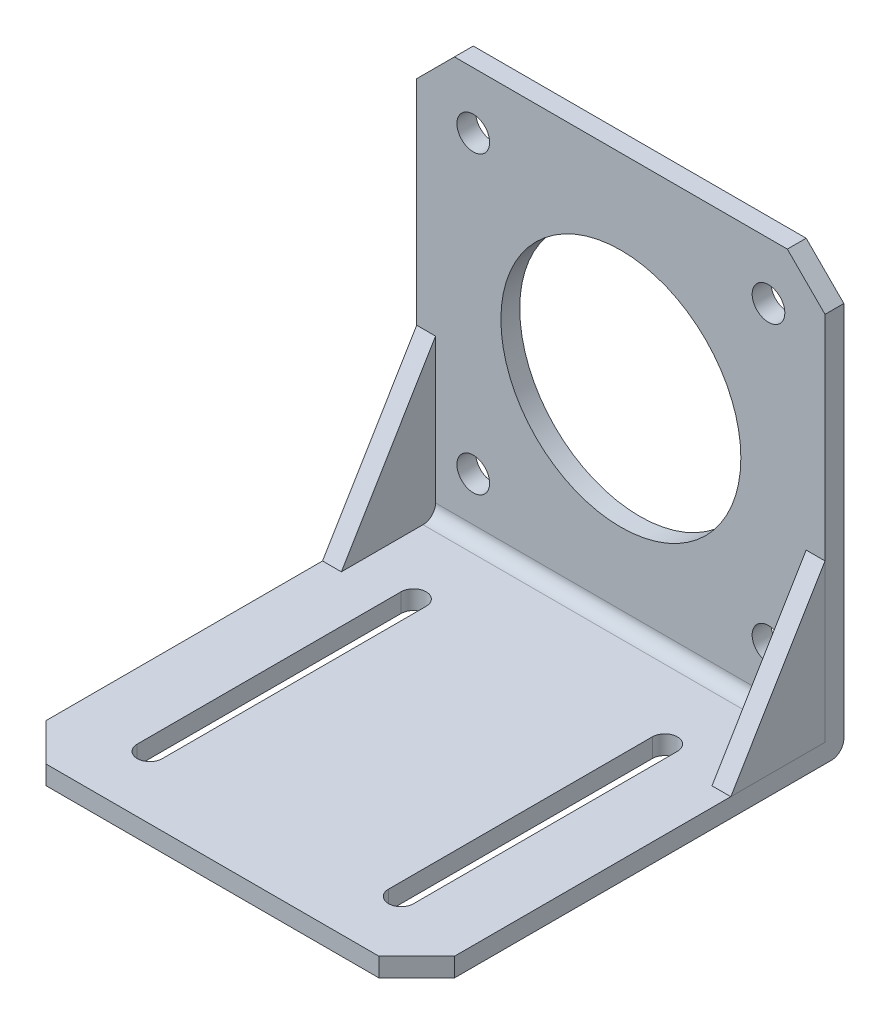
ISO-10303-21;
HEADER;
FILE_DESCRIPTION(('STEP AP214'),'2;1');
FILE_NAME('part.step','',(''),(''),'','','');
FILE_SCHEMA(('AUTOMOTIVE_DESIGN { 1 0 10303 214 1 1 1 1 }'));
ENDSEC;
DATA;
#1=APPLICATION_CONTEXT('core data for automotive mechanical design processes');
#2=APPLICATION_PROTOCOL_DEFINITION('international standard','automotive_design',2000,#1);
#3=PRODUCT_CONTEXT('',#1,'mechanical');
#4=PRODUCT('Part','Part','',(#3));
#5=PRODUCT_RELATED_PRODUCT_CATEGORY('part','',(#4));
#6=PRODUCT_DEFINITION_FORMATION('','',#4);
#7=PRODUCT_DEFINITION_CONTEXT('part definition',#1,'design');
#8=PRODUCT_DEFINITION('design','',#6,#7);
#9=PRODUCT_DEFINITION_SHAPE('','',#8);
#10=(LENGTH_UNIT() NAMED_UNIT(*) SI_UNIT(.MILLI.,.METRE.));
#11=(NAMED_UNIT(*) PLANE_ANGLE_UNIT() SI_UNIT($,.RADIAN.));
#12=(NAMED_UNIT(*) SI_UNIT($,.STERADIAN.) SOLID_ANGLE_UNIT());
#13=UNCERTAINTY_MEASURE_WITH_UNIT(LENGTH_MEASURE(1.E-05),#10,'distance_accuracy_value','');
#14=(GEOMETRIC_REPRESENTATION_CONTEXT(3) GLOBAL_UNCERTAINTY_ASSIGNED_CONTEXT((#13)) GLOBAL_UNIT_ASSIGNED_CONTEXT((#10,
#11,#12)) REPRESENTATION_CONTEXT('',''));
#15=CARTESIAN_POINT('',(0.,0.,0.));
#16=DIRECTION('',(0.,0.,1.));
#17=DIRECTION('',(1.,0.,0.));
#18=AXIS2_PLACEMENT_3D('',#15,#16,#17);
#19=CARTESIAN_POINT('',(-29.5,-32.5,3.));
#20=DIRECTION('',(0.,0.,-1.));
#21=DIRECTION('',(-1.,0.,0.));
#22=AXIS2_PLACEMENT_3D('',#19,#20,#21);
#23=PLANE('',#22);
#24=DIRECTION('',(0.,-1.,0.));
#25=VECTOR('',#24,1.);
#26=CARTESIAN_POINT('',(-32.5,-32.5,3.));
#27=LINE('',#26,#25);
#28=CARTESIAN_POINT('',(-32.5,-7.50000000000001,3.));
#29=VERTEX_POINT('',#28);
#30=CARTESIAN_POINT('',(-32.5,-32.5,3.));
#31=VERTEX_POINT('',#30);
#32=EDGE_CURVE('E95',#29,#31,#27,.T.);
#33=ORIENTED_EDGE('',*,*,#32,.F.);
#34=DIRECTION('',(-1.,0.,0.));
#35=VECTOR('',#34,1.);
#36=CARTESIAN_POINT('',(-29.5,-7.50000000000001,3.));
#37=LINE('',#36,#35);
#38=CARTESIAN_POINT('',(-29.5,-7.50000000000001,3.));
#39=VERTEX_POINT('',#38);
#40=EDGE_CURVE('E12',#39,#29,#37,.T.);
#41=ORIENTED_EDGE('',*,*,#40,.F.);
#42=DIRECTION('',(0.,-1.,0.));
#43=VECTOR('',#42,1.);
#44=CARTESIAN_POINT('',(-29.5,-32.5,3.));
#45=LINE('',#44,#43);
#46=CARTESIAN_POINT('',(-29.5,-32.5,3.));
#47=VERTEX_POINT('',#46);
#48=EDGE_CURVE('E87',#39,#47,#45,.T.);
#49=ORIENTED_EDGE('',*,*,#48,.T.);
#50=DIRECTION('',(-1.,0.,0.));
#51=VECTOR('',#50,1.);
#52=CARTESIAN_POINT('',(-29.5,-32.5,3.));
#53=LINE('',#52,#51);
#54=EDGE_CURVE('E46',#47,#31,#53,.T.);
#55=ORIENTED_EDGE('',*,*,#54,.T.);
#56=EDGE_LOOP('',(#33,#41,#49,#55));
#57=FACE_BOUND('',#56,.T.);
#58=ADVANCED_FACE('F43',(#57),#23,.T.);
#59=CARTESIAN_POINT('',(-29.5,-7.50000000000001,3.));
#60=DIRECTION('',(0.,0.514495755427527,0.857492925712544));
#61=DIRECTION('',(0.,-0.857492925712544,0.514495755427527));
#62=AXIS2_PLACEMENT_3D('',#59,#60,#61);
#63=PLANE('',#62);
#64=DIRECTION('',(0.,0.857492925712544,-0.514495755427526));
#65=VECTOR('',#64,1.);
#66=CARTESIAN_POINT('',(-32.5,-7.50000000000001,3.));
#67=LINE('',#66,#65);
#68=CARTESIAN_POINT('',(-32.5,-32.5,18.));
#69=VERTEX_POINT('',#68);
#70=EDGE_CURVE('E89',#69,#29,#67,.T.);
#71=ORIENTED_EDGE('',*,*,#70,.F.);
#72=DIRECTION('',(-1.,0.,0.));
#73=VECTOR('',#72,1.);
#74=CARTESIAN_POINT('',(-29.5,-32.5,18.));
#75=LINE('',#74,#73);
#76=CARTESIAN_POINT('',(-29.5,-32.5,18.));
#77=VERTEX_POINT('',#76);
#78=EDGE_CURVE('E52',#77,#69,#75,.T.);
#79=ORIENTED_EDGE('',*,*,#78,.F.);
#80=DIRECTION('',(0.,0.857492925712544,-0.514495755427526));
#81=VECTOR('',#80,1.);
#82=CARTESIAN_POINT('',(-29.5,-7.50000000000001,3.));
#83=LINE('',#82,#81);
#84=EDGE_CURVE('E84',#77,#39,#83,.T.);
#85=ORIENTED_EDGE('',*,*,#84,.T.);
#86=ORIENTED_EDGE('',*,*,#40,.T.);
#87=EDGE_LOOP('',(#71,#79,#85,#86));
#88=FACE_BOUND('',#87,.T.);
#89=ADVANCED_FACE('F99',(#88),#63,.T.);
#90=CARTESIAN_POINT('',(-29.5,-32.5,18.));
#91=DIRECTION('',(0.,-1.,0.));
#92=DIRECTION('',(0.,0.,-1.));
#93=AXIS2_PLACEMENT_3D('',#90,#91,#92);
#94=PLANE('',#93);
#95=DIRECTION('',(0.,0.,1.));
#96=VECTOR('',#95,1.);
#97=CARTESIAN_POINT('',(-32.5,-32.5,18.));
#98=LINE('',#97,#96);
#99=EDGE_CURVE('E82',#31,#69,#98,.T.);
#100=ORIENTED_EDGE('',*,*,#99,.F.);
#101=ORIENTED_EDGE('',*,*,#54,.F.);
#102=DIRECTION('',(0.,0.,1.));
#103=VECTOR('',#102,1.);
#104=CARTESIAN_POINT('',(-29.5,-32.5,18.));
#105=LINE('',#104,#103);
#106=EDGE_CURVE('E80',#47,#77,#105,.T.);
#107=ORIENTED_EDGE('',*,*,#106,.T.);
#108=ORIENTED_EDGE('',*,*,#78,.T.);
#109=EDGE_LOOP('',(#100,#101,#107,#108));
#110=FACE_BOUND('',#109,.T.);
#111=ADVANCED_FACE('F79',(#110),#94,.T.);
#112=CARTESIAN_POINT('',(-29.5,0.,0.));
#113=DIRECTION('',(-1.,0.,0.));
#114=DIRECTION('',(0.,0.,1.));
#115=AXIS2_PLACEMENT_3D('',#112,#113,#114);
#116=PLANE('',#115);
#117=ORIENTED_EDGE('',*,*,#48,.F.);
#118=ORIENTED_EDGE('',*,*,#84,.F.);
#119=ORIENTED_EDGE('',*,*,#106,.F.);
#120=EDGE_LOOP('',(#117,#118,#119));
#121=FACE_BOUND('',#120,.T.);
#122=ADVANCED_FACE('F86',(#121),#116,.F.);
#123=CARTESIAN_POINT('',(-32.5,0.,0.));
#124=DIRECTION('',(-1.,0.,0.));
#125=DIRECTION('',(0.,0.,1.));
#126=AXIS2_PLACEMENT_3D('',#123,#124,#125);
#127=PLANE('',#126);
#128=ORIENTED_EDGE('',*,*,#32,.T.);
#129=ORIENTED_EDGE('',*,*,#99,.T.);
#130=ORIENTED_EDGE('',*,*,#70,.T.);
#131=EDGE_LOOP('',(#128,#129,#130));
#132=FACE_BOUND('',#131,.T.);
#133=ADVANCED_FACE('F98',(#132),#127,.T.);
#134=CLOSED_SHELL('',(#58,#89,#111,#122,#133));
#135=MANIFOLD_SOLID_BREP('B2',#134);
#136=CARTESIAN_POINT('',(29.5,-7.50000000000001,3.));
#137=DIRECTION('',(0.,0.,-1.));
#138=DIRECTION('',(-1.,0.,0.));
#139=AXIS2_PLACEMENT_3D('',#136,#137,#138);
#140=PLANE('',#139);
#141=DIRECTION('',(0.,1.,0.));
#142=VECTOR('',#141,1.);
#143=CARTESIAN_POINT('',(32.5,-7.50000000000001,3.));
#144=LINE('',#143,#142);
#145=CARTESIAN_POINT('',(32.5,-32.5,3.));
#146=VERTEX_POINT('',#145);
#147=CARTESIAN_POINT('',(32.5,-7.50000000000001,3.));
#148=VERTEX_POINT('',#147);
#149=EDGE_CURVE('E201',#146,#148,#144,.T.);
#150=ORIENTED_EDGE('',*,*,#149,.F.);
#151=DIRECTION('',(1.,0.,0.));
#152=VECTOR('',#151,1.);
#153=CARTESIAN_POINT('',(29.5,-32.5,3.));
#154=LINE('',#153,#152);
#155=CARTESIAN_POINT('',(29.5,-32.5,3.));
#156=VERTEX_POINT('',#155);
#157=EDGE_CURVE('E41',#156,#146,#154,.T.);
#158=ORIENTED_EDGE('',*,*,#157,.F.);
#159=DIRECTION('',(0.,1.,0.));
#160=VECTOR('',#159,1.);
#161=CARTESIAN_POINT('',(29.5,-7.50000000000001,3.));
#162=LINE('',#161,#160);
#163=CARTESIAN_POINT('',(29.5,-7.50000000000001,3.));
#164=VERTEX_POINT('',#163);
#165=EDGE_CURVE('E193',#156,#164,#162,.T.);
#166=ORIENTED_EDGE('',*,*,#165,.T.);
#167=DIRECTION('',(1.,0.,0.));
#168=VECTOR('',#167,1.);
#169=CARTESIAN_POINT('',(29.5,-7.50000000000001,3.));
#170=LINE('',#169,#168);
#171=EDGE_CURVE('E152',#164,#148,#170,.T.);
#172=ORIENTED_EDGE('',*,*,#171,.T.);
#173=EDGE_LOOP('',(#150,#158,#166,#172));
#174=FACE_BOUND('',#173,.T.);
#175=ADVANCED_FACE('F149',(#174),#140,.T.);
#176=CARTESIAN_POINT('',(29.5,-32.5,3.));
#177=DIRECTION('',(0.,-1.,0.));
#178=DIRECTION('',(0.,0.,-1.));
#179=AXIS2_PLACEMENT_3D('',#176,#177,#178);
#180=PLANE('',#179);
#181=DIRECTION('',(0.,0.,-1.));
#182=VECTOR('',#181,1.);
#183=CARTESIAN_POINT('',(32.5,-32.5,3.));
#184=LINE('',#183,#182);
#185=CARTESIAN_POINT('',(32.5,-32.5,18.));
#186=VERTEX_POINT('',#185);
#187=EDGE_CURVE('E195',#186,#146,#184,.T.);
#188=ORIENTED_EDGE('',*,*,#187,.F.);
#189=DIRECTION('',(1.,0.,0.));
#190=VECTOR('',#189,1.);
#191=CARTESIAN_POINT('',(29.5,-32.5,18.));
#192=LINE('',#191,#190);
#193=CARTESIAN_POINT('',(29.5,-32.5,18.));
#194=VERTEX_POINT('',#193);
#195=EDGE_CURVE('E158',#194,#186,#192,.T.);
#196=ORIENTED_EDGE('',*,*,#195,.F.);
#197=DIRECTION('',(0.,0.,-1.));
#198=VECTOR('',#197,1.);
#199=CARTESIAN_POINT('',(29.5,-32.5,3.));
#200=LINE('',#199,#198);
#201=EDGE_CURVE('E190',#194,#156,#200,.T.);
#202=ORIENTED_EDGE('',*,*,#201,.T.);
#203=ORIENTED_EDGE('',*,*,#157,.T.);
#204=EDGE_LOOP('',(#188,#196,#202,#203));
#205=FACE_BOUND('',#204,.T.);
#206=ADVANCED_FACE('F205',(#205),#180,.T.);
#207=CARTESIAN_POINT('',(29.5,-7.50000000000001,3.));
#208=DIRECTION('',(0.,0.514495755427527,0.857492925712544));
#209=DIRECTION('',(0.,-0.857492925712544,0.514495755427527));
#210=AXIS2_PLACEMENT_3D('',#207,#208,#209);
#211=PLANE('',#210);
#212=DIRECTION('',(0.,-0.857492925712544,0.514495755427526));
#213=VECTOR('',#212,1.);
#214=CARTESIAN_POINT('',(32.5,-7.50000000000001,3.));
#215=LINE('',#214,#213);
#216=EDGE_CURVE('E188',#148,#186,#215,.T.);
#217=ORIENTED_EDGE('',*,*,#216,.F.);
#218=ORIENTED_EDGE('',*,*,#171,.F.);
#219=DIRECTION('',(0.,-0.857492925712544,0.514495755427526));
#220=VECTOR('',#219,1.);
#221=CARTESIAN_POINT('',(29.5,-7.50000000000001,3.));
#222=LINE('',#221,#220);
#223=EDGE_CURVE('E186',#164,#194,#222,.T.);
#224=ORIENTED_EDGE('',*,*,#223,.T.);
#225=ORIENTED_EDGE('',*,*,#195,.T.);
#226=EDGE_LOOP('',(#217,#218,#224,#225));
#227=FACE_BOUND('',#226,.T.);
#228=ADVANCED_FACE('F185',(#227),#211,.T.);
#229=CARTESIAN_POINT('',(29.5,0.,0.));
#230=DIRECTION('',(-1.,0.,0.));
#231=DIRECTION('',(0.,0.,1.));
#232=AXIS2_PLACEMENT_3D('',#229,#230,#231);
#233=PLANE('',#232);
#234=ORIENTED_EDGE('',*,*,#165,.F.);
#235=ORIENTED_EDGE('',*,*,#201,.F.);
#236=ORIENTED_EDGE('',*,*,#223,.F.);
#237=EDGE_LOOP('',(#234,#235,#236));
#238=FACE_BOUND('',#237,.T.);
#239=ADVANCED_FACE('F192',(#238),#233,.T.);
#240=CARTESIAN_POINT('',(32.5,0.,0.));
#241=DIRECTION('',(-1.,0.,0.));
#242=DIRECTION('',(0.,0.,1.));
#243=AXIS2_PLACEMENT_3D('',#240,#241,#242);
#244=PLANE('',#243);
#245=ORIENTED_EDGE('',*,*,#149,.T.);
#246=ORIENTED_EDGE('',*,*,#216,.T.);
#247=ORIENTED_EDGE('',*,*,#187,.T.);
#248=EDGE_LOOP('',(#245,#246,#247));
#249=FACE_BOUND('',#248,.T.);
#250=ADVANCED_FACE('F204',(#249),#244,.F.);
#251=CLOSED_SHELL('',(#175,#206,#228,#239,#250));
#252=MANIFOLD_SOLID_BREP('B6',#251);
#253=CARTESIAN_POINT('',(32.5,-32.5,3.));
#254=DIRECTION('',(-1.,0.,0.));
#255=DIRECTION('',(0.,0.,1.));
#256=AXIS2_PLACEMENT_3D('',#253,#254,#255);
#257=PLANE('',#256);
#258=DIRECTION('',(0.,0.,1.));
#259=VECTOR('',#258,1.);
#260=CARTESIAN_POINT('',(32.5,-32.5,0.));
#261=LINE('',#260,#259);
#262=CARTESIAN_POINT('',(32.5,-32.5,5.));
#263=VERTEX_POINT('',#262);
#264=CARTESIAN_POINT('',(32.5,-32.5,62.));
#265=VERTEX_POINT('',#264);
#266=EDGE_CURVE('E460',#263,#265,#261,.T.);
#267=ORIENTED_EDGE('',*,*,#266,.T.);
#268=DIRECTION('',(0.,-1.,0.));
#269=VECTOR('',#268,1.);
#270=CARTESIAN_POINT('',(32.5,-32.5,62.));
#271=LINE('',#270,#269);
#272=CARTESIAN_POINT('',(32.5,-35.5,62.));
#273=VERTEX_POINT('',#272);
#274=EDGE_CURVE('E147',#265,#273,#271,.T.);
#275=ORIENTED_EDGE('',*,*,#274,.T.);
#276=DIRECTION('',(0.,0.,1.));
#277=VECTOR('',#276,1.);
#278=CARTESIAN_POINT('',(32.5,-35.5,0.));
#279=LINE('',#278,#277);
#280=CARTESIAN_POINT('',(32.5,-35.5,2.));
#281=VERTEX_POINT('',#280);
#282=EDGE_CURVE('E461',#281,#273,#279,.T.);
#283=ORIENTED_EDGE('',*,*,#282,.F.);
#284=CARTESIAN_POINT('',(32.5,-33.5,2.));
#285=DIRECTION('',(-1.,0.,0.));
#286=DIRECTION('',(0.,0.,1.));
#287=AXIS2_PLACEMENT_3D('',#284,#285,#286);
#288=CIRCLE('',#287,2.);
#289=CARTESIAN_POINT('',(32.5,-33.5,0.));
#290=VERTEX_POINT('',#289);
#291=EDGE_CURVE('E484',#281,#290,#288,.F.);
#292=ORIENTED_EDGE('',*,*,#291,.T.);
#293=DIRECTION('',(0.,1.,0.));
#294=VECTOR('',#293,1.);
#295=CARTESIAN_POINT('',(32.5,-32.5,0.));
#296=LINE('',#295,#294);
#297=CARTESIAN_POINT('',(32.5,26.5,0.));
#298=VERTEX_POINT('',#297);
#299=EDGE_CURVE('E468',#290,#298,#296,.T.);
#300=ORIENTED_EDGE('',*,*,#299,.T.);
#301=DIRECTION('',(0.,0.,1.));
#302=VECTOR('',#301,1.);
#303=CARTESIAN_POINT('',(32.5,26.5,3.));
#304=LINE('',#303,#302);
#305=CARTESIAN_POINT('',(32.5,26.5,3.));
#306=VERTEX_POINT('',#305);
#307=EDGE_CURVE('E254',#298,#306,#304,.T.);
#308=ORIENTED_EDGE('',*,*,#307,.T.);
#309=DIRECTION('',(0.,1.,0.));
#310=VECTOR('',#309,1.);
#311=CARTESIAN_POINT('',(32.5,-32.5,3.));
#312=LINE('',#311,#310);
#313=CARTESIAN_POINT('',(32.5,-30.5,3.));
#314=VERTEX_POINT('',#313);
#315=EDGE_CURVE('E507',#314,#306,#312,.T.);
#316=ORIENTED_EDGE('',*,*,#315,.F.);
#317=CARTESIAN_POINT('',(32.5,-30.5,5.));
#318=DIRECTION('',(-1.,0.,0.));
#319=DIRECTION('',(0.,0.,1.));
#320=AXIS2_PLACEMENT_3D('',#317,#318,#319);
#321=CIRCLE('',#320,2.);
#322=EDGE_CURVE('E492',#314,#263,#321,.T.);
#323=ORIENTED_EDGE('',*,*,#322,.T.);
#324=EDGE_LOOP('',(#267,#275,#283,#292,#300,#308,#316,#323));
#325=FACE_BOUND('',#324,.T.);
#326=ADVANCED_FACE('F246',(#325),#257,.F.);
#327=CARTESIAN_POINT('',(-32.5,32.5,3.));
#328=DIRECTION('',(0.,-1.,0.));
#329=DIRECTION('',(0.,0.,-1.));
#330=AXIS2_PLACEMENT_3D('',#327,#328,#329);
#331=PLANE('',#330);
#332=DIRECTION('',(-1.,0.,0.));
#333=VECTOR('',#332,1.);
#334=CARTESIAN_POINT('',(-32.5,32.5,0.));
#335=LINE('',#334,#333);
#336=CARTESIAN_POINT('',(26.5,32.5,0.));
#337=VERTEX_POINT('',#336);
#338=CARTESIAN_POINT('',(-26.5,32.5,0.));
#339=VERTEX_POINT('',#338);
#340=EDGE_CURVE('E510',#337,#339,#335,.T.);
#341=ORIENTED_EDGE('',*,*,#340,.T.);
#342=DIRECTION('',(0.,0.,1.));
#343=VECTOR('',#342,1.);
#344=CARTESIAN_POINT('',(-26.5,32.5,3.));
#345=LINE('',#344,#343);
#346=CARTESIAN_POINT('',(-26.5,32.5,3.));
#347=VERTEX_POINT('',#346);
#348=EDGE_CURVE('E532',#339,#347,#345,.T.);
#349=ORIENTED_EDGE('',*,*,#348,.T.);
#350=DIRECTION('',(-1.,0.,0.));
#351=VECTOR('',#350,1.);
#352=CARTESIAN_POINT('',(-32.5,32.5,3.));
#353=LINE('',#352,#351);
#354=CARTESIAN_POINT('',(26.5,32.5,3.));
#355=VERTEX_POINT('',#354);
#356=EDGE_CURVE('E504',#355,#347,#353,.T.);
#357=ORIENTED_EDGE('',*,*,#356,.F.);
#358=DIRECTION('',(0.,0.,-1.));
#359=VECTOR('',#358,1.);
#360=CARTESIAN_POINT('',(26.5,32.5,3.));
#361=LINE('',#360,#359);
#362=EDGE_CURVE('E530',#355,#337,#361,.T.);
#363=ORIENTED_EDGE('',*,*,#362,.T.);
#364=EDGE_LOOP('',(#341,#349,#357,#363));
#365=FACE_BOUND('',#364,.T.);
#366=ADVANCED_FACE('F574',(#365),#331,.F.);
#367=CARTESIAN_POINT('',(-32.5,-32.5,3.));
#368=DIRECTION('',(1.,0.,0.));
#369=DIRECTION('',(0.,0.,-1.));
#370=AXIS2_PLACEMENT_3D('',#367,#368,#369);
#371=PLANE('',#370);
#372=DIRECTION('',(0.,-1.,0.));
#373=VECTOR('',#372,1.);
#374=CARTESIAN_POINT('',(-32.5,-32.5,3.));
#375=LINE('',#374,#373);
#376=CARTESIAN_POINT('',(-32.5,26.5,3.));
#377=VERTEX_POINT('',#376);
#378=CARTESIAN_POINT('',(-32.5,-30.5,3.));
#379=VERTEX_POINT('',#378);
#380=EDGE_CURVE('E499',#377,#379,#375,.T.);
#381=ORIENTED_EDGE('',*,*,#380,.F.);
#382=DIRECTION('',(0.,0.,-1.));
#383=VECTOR('',#382,1.);
#384=CARTESIAN_POINT('',(-32.5,26.5,3.));
#385=LINE('',#384,#383);
#386=CARTESIAN_POINT('',(-32.5,26.5,0.));
#387=VERTEX_POINT('',#386);
#388=EDGE_CURVE('E568',#377,#387,#385,.T.);
#389=ORIENTED_EDGE('',*,*,#388,.T.);
#390=DIRECTION('',(0.,-1.,0.));
#391=VECTOR('',#390,1.);
#392=CARTESIAN_POINT('',(-32.5,-32.5,0.));
#393=LINE('',#392,#391);
#394=CARTESIAN_POINT('',(-32.5,-33.5,0.));
#395=VERTEX_POINT('',#394);
#396=EDGE_CURVE('E513',#387,#395,#393,.T.);
#397=ORIENTED_EDGE('',*,*,#396,.T.);
#398=CARTESIAN_POINT('',(-32.5,-33.5,2.));
#399=DIRECTION('',(1.,0.,0.));
#400=DIRECTION('',(0.,0.,-1.));
#401=AXIS2_PLACEMENT_3D('',#398,#399,#400);
#402=CIRCLE('',#401,2.);
#403=CARTESIAN_POINT('',(-32.5,-35.5,2.));
#404=VERTEX_POINT('',#403);
#405=EDGE_CURVE('E489',#395,#404,#402,.F.);
#406=ORIENTED_EDGE('',*,*,#405,.T.);
#407=DIRECTION('',(0.,0.,-1.));
#408=VECTOR('',#407,1.);
#409=CARTESIAN_POINT('',(-32.5,-35.5,0.));
#410=LINE('',#409,#408);
#411=CARTESIAN_POINT('',(-32.5,-35.5,62.));
#412=VERTEX_POINT('',#411);
#413=EDGE_CURVE('E466',#412,#404,#410,.T.);
#414=ORIENTED_EDGE('',*,*,#413,.F.);
#415=DIRECTION('',(0.,1.,0.));
#416=VECTOR('',#415,1.);
#417=CARTESIAN_POINT('',(-32.5,-32.5,62.));
#418=LINE('',#417,#416);
#419=CARTESIAN_POINT('',(-32.5,-32.5,62.));
#420=VERTEX_POINT('',#419);
#421=EDGE_CURVE('E497',#412,#420,#418,.T.);
#422=ORIENTED_EDGE('',*,*,#421,.T.);
#423=DIRECTION('',(0.,0.,-1.));
#424=VECTOR('',#423,1.);
#425=CARTESIAN_POINT('',(-32.5,-32.5,0.));
#426=LINE('',#425,#424);
#427=CARTESIAN_POINT('',(-32.5,-32.5,5.));
#428=VERTEX_POINT('',#427);
#429=EDGE_CURVE('E464',#420,#428,#426,.T.);
#430=ORIENTED_EDGE('',*,*,#429,.T.);
#431=CARTESIAN_POINT('',(-32.5,-30.5,5.));
#432=DIRECTION('',(1.,0.,0.));
#433=DIRECTION('',(0.,0.,-1.));
#434=AXIS2_PLACEMENT_3D('',#431,#432,#433);
#435=CIRCLE('',#434,2.);
#436=EDGE_CURVE('E494',#428,#379,#435,.T.);
#437=ORIENTED_EDGE('',*,*,#436,.T.);
#438=EDGE_LOOP('',(#381,#389,#397,#406,#414,#422,#430,#437));
#439=FACE_BOUND('',#438,.T.);
#440=ADVANCED_FACE('F563',(#439),#371,.F.);
#441=CARTESIAN_POINT('',(0.,0.,3.));
#442=DIRECTION('',(0.,0.,-1.));
#443=DIRECTION('',(-1.,0.,0.));
#444=AXIS2_PLACEMENT_3D('',#441,#442,#443);
#445=PLANE('',#444);
#446=CARTESIAN_POINT('',(0.,0.,3.));
#447=DIRECTION('',(0.,0.,1.));
#448=DIRECTION('',(1.,0.,0.));
#449=AXIS2_PLACEMENT_3D('',#446,#447,#448);
#450=CIRCLE('',#449,19.1);
#451=CARTESIAN_POINT('',(19.1,0.,3.));
#452=VERTEX_POINT('',#451);
#453=EDGE_CURVE('E771',#452,#452,#450,.T.);
#454=ORIENTED_EDGE('',*,*,#453,.F.);
#455=EDGE_LOOP('',(#454));
#456=FACE_BOUND('',#455,.T.);
#457=CARTESIAN_POINT('',(-23.5,23.5,3.));
#458=DIRECTION('',(0.,0.,1.));
#459=DIRECTION('',(1.,0.,0.));
#460=AXIS2_PLACEMENT_3D('',#457,#458,#459);
#461=CIRCLE('',#460,2.6);
#462=CARTESIAN_POINT('',(-20.9,23.5,3.));
#463=VERTEX_POINT('',#462);
#464=EDGE_CURVE('E773',#463,#463,#461,.T.);
#465=ORIENTED_EDGE('',*,*,#464,.F.);
#466=EDGE_LOOP('',(#465));
#467=FACE_BOUND('',#466,.T.);
#468=CARTESIAN_POINT('',(23.5,23.5,3.));
#469=DIRECTION('',(0.,0.,1.));
#470=DIRECTION('',(1.,0.,0.));
#471=AXIS2_PLACEMENT_3D('',#468,#469,#470);
#472=CIRCLE('',#471,2.6);
#473=CARTESIAN_POINT('',(26.1,23.5,3.));
#474=VERTEX_POINT('',#473);
#475=EDGE_CURVE('E781',#474,#474,#472,.T.);
#476=ORIENTED_EDGE('',*,*,#475,.F.);
#477=EDGE_LOOP('',(#476));
#478=FACE_BOUND('',#477,.T.);
#479=CARTESIAN_POINT('',(23.5,-23.5,3.));
#480=DIRECTION('',(0.,0.,1.));
#481=DIRECTION('',(1.,0.,0.));
#482=AXIS2_PLACEMENT_3D('',#479,#480,#481);
#483=CIRCLE('',#482,2.6);
#484=CARTESIAN_POINT('',(26.1,-23.5,3.));
#485=VERTEX_POINT('',#484);
#486=EDGE_CURVE('E787',#485,#485,#483,.T.);
#487=ORIENTED_EDGE('',*,*,#486,.F.);
#488=EDGE_LOOP('',(#487));
#489=FACE_BOUND('',#488,.T.);
#490=CARTESIAN_POINT('',(-23.5,-23.5,3.));
#491=DIRECTION('',(0.,0.,1.));
#492=DIRECTION('',(1.,0.,0.));
#493=AXIS2_PLACEMENT_3D('',#490,#491,#492);
#494=CIRCLE('',#493,2.6);
#495=CARTESIAN_POINT('',(-20.9,-23.5,3.));
#496=VERTEX_POINT('',#495);
#497=EDGE_CURVE('E793',#496,#496,#494,.T.);
#498=ORIENTED_EDGE('',*,*,#497,.F.);
#499=EDGE_LOOP('',(#498));
#500=FACE_BOUND('',#499,.T.);
#501=ORIENTED_EDGE('',*,*,#356,.T.);
#502=DIRECTION('',(0.707106781186548,0.707106781186547,0.));
#503=VECTOR('',#502,1.);
#504=CARTESIAN_POINT('',(-32.5,26.5,3.));
#505=LINE('',#504,#503);
#506=EDGE_CURVE('E531',#347,#377,#505,.F.);
#507=ORIENTED_EDGE('',*,*,#506,.T.);
#508=ORIENTED_EDGE('',*,*,#380,.T.);
#509=DIRECTION('',(1.,0.,0.));
#510=VECTOR('',#509,1.);
#511=CARTESIAN_POINT('',(32.5,-30.5,3.));
#512=LINE('',#511,#510);
#513=EDGE_CURVE('E476',#379,#314,#512,.T.);
#514=ORIENTED_EDGE('',*,*,#513,.T.);
#515=ORIENTED_EDGE('',*,*,#315,.T.);
#516=DIRECTION('',(0.707106781186547,-0.707106781186548,0.));
#517=VECTOR('',#516,1.);
#518=CARTESIAN_POINT('',(26.5,32.5,3.));
#519=LINE('',#518,#517);
#520=EDGE_CURVE('E523',#306,#355,#519,.F.);
#521=ORIENTED_EDGE('',*,*,#520,.T.);
#522=EDGE_LOOP('',(#501,#507,#508,#514,#515,#521));
#523=FACE_BOUND('',#522,.T.);
#524=ADVANCED_FACE('F522',(#456,#467,#478,#489,#500,#523),#445,.F.);
#525=CARTESIAN_POINT('',(0.,0.,0.));
#526=DIRECTION('',(0.,0.,-1.));
#527=DIRECTION('',(-1.,0.,0.));
#528=AXIS2_PLACEMENT_3D('',#525,#526,#527);
#529=PLANE('',#528);
#530=CARTESIAN_POINT('',(0.,0.,0.));
#531=DIRECTION('',(0.,0.,-1.));
#532=DIRECTION('',(-1.,0.,0.));
#533=AXIS2_PLACEMENT_3D('',#530,#531,#532);
#534=CIRCLE('',#533,19.1);
#535=CARTESIAN_POINT('',(-19.1,0.,0.));
#536=VERTEX_POINT('',#535);
#537=EDGE_CURVE('E768',#536,#536,#534,.T.);
#538=ORIENTED_EDGE('',*,*,#537,.F.);
#539=EDGE_LOOP('',(#538));
#540=FACE_BOUND('',#539,.T.);
#541=CARTESIAN_POINT('',(-23.5,23.5,0.));
#542=DIRECTION('',(0.,0.,-1.));
#543=DIRECTION('',(-1.,0.,0.));
#544=AXIS2_PLACEMENT_3D('',#541,#542,#543);
#545=CIRCLE('',#544,2.6);
#546=CARTESIAN_POINT('',(-26.1,23.5,0.));
#547=VERTEX_POINT('',#546);
#548=EDGE_CURVE('E778',#547,#547,#545,.T.);
#549=ORIENTED_EDGE('',*,*,#548,.F.);
#550=EDGE_LOOP('',(#549));
#551=FACE_BOUND('',#550,.T.);
#552=CARTESIAN_POINT('',(23.5,23.5,0.));
#553=DIRECTION('',(0.,0.,-1.));
#554=DIRECTION('',(-1.,0.,0.));
#555=AXIS2_PLACEMENT_3D('',#552,#553,#554);
#556=CIRCLE('',#555,2.6);
#557=CARTESIAN_POINT('',(20.9,23.5,0.));
#558=VERTEX_POINT('',#557);
#559=EDGE_CURVE('E784',#558,#558,#556,.T.);
#560=ORIENTED_EDGE('',*,*,#559,.F.);
#561=EDGE_LOOP('',(#560));
#562=FACE_BOUND('',#561,.T.);
#563=CARTESIAN_POINT('',(23.5,-23.5,0.));
#564=DIRECTION('',(0.,0.,-1.));
#565=DIRECTION('',(-1.,0.,0.));
#566=AXIS2_PLACEMENT_3D('',#563,#564,#565);
#567=CIRCLE('',#566,2.6);
#568=CARTESIAN_POINT('',(20.9,-23.5,0.));
#569=VERTEX_POINT('',#568);
#570=EDGE_CURVE('E790',#569,#569,#567,.T.);
#571=ORIENTED_EDGE('',*,*,#570,.F.);
#572=EDGE_LOOP('',(#571));
#573=FACE_BOUND('',#572,.T.);
#574=CARTESIAN_POINT('',(-23.5,-23.5,0.));
#575=DIRECTION('',(0.,0.,-1.));
#576=DIRECTION('',(-1.,0.,0.));
#577=AXIS2_PLACEMENT_3D('',#574,#575,#576);
#578=CIRCLE('',#577,2.6);
#579=CARTESIAN_POINT('',(-26.1,-23.5,0.));
#580=VERTEX_POINT('',#579);
#581=EDGE_CURVE('E419',#580,#580,#578,.T.);
#582=ORIENTED_EDGE('',*,*,#581,.F.);
#583=EDGE_LOOP('',(#582));
#584=FACE_BOUND('',#583,.T.);
#585=ORIENTED_EDGE('',*,*,#396,.F.);
#586=DIRECTION('',(-0.707106781186548,-0.707106781186547,0.));
#587=VECTOR('',#586,1.);
#588=CARTESIAN_POINT('',(-29.5,29.5,0.));
#589=LINE('',#588,#587);
#590=EDGE_CURVE('E569',#387,#339,#589,.F.);
#591=ORIENTED_EDGE('',*,*,#590,.T.);
#592=ORIENTED_EDGE('',*,*,#340,.F.);
#593=DIRECTION('',(-0.707106781186547,0.707106781186548,0.));
#594=VECTOR('',#593,1.);
#595=CARTESIAN_POINT('',(29.5,29.5,0.));
#596=LINE('',#595,#594);
#597=EDGE_CURVE('E556',#337,#298,#596,.F.);
#598=ORIENTED_EDGE('',*,*,#597,.T.);
#599=ORIENTED_EDGE('',*,*,#299,.F.);
#600=DIRECTION('',(1.,0.,0.));
#601=VECTOR('',#600,1.);
#602=CARTESIAN_POINT('',(0.,-33.5,0.));
#603=LINE('',#602,#601);
#604=EDGE_CURVE('E486',#290,#395,#603,.F.);
#605=ORIENTED_EDGE('',*,*,#604,.T.);
#606=EDGE_LOOP('',(#585,#591,#592,#598,#599,#605));
#607=FACE_BOUND('',#606,.T.);
#608=ADVANCED_FACE('F553',(#540,#551,#562,#573,#584,#607),#529,.T.);
#609=CARTESIAN_POINT('',(0.,-35.5,0.));
#610=DIRECTION('',(0.,-1.,0.));
#611=DIRECTION('',(0.,0.,-1.));
#612=AXIS2_PLACEMENT_3D('',#609,#610,#611);
#613=PLANE('',#612);
#614=DIRECTION('',(-1.,0.,0.));
#615=VECTOR('',#614,1.);
#616=CARTESIAN_POINT('',(32.5,-35.5,68.));
#617=LINE('',#616,#615);
#618=CARTESIAN_POINT('',(26.5,-35.5,68.));
#619=VERTEX_POINT('',#618);
#620=CARTESIAN_POINT('',(-26.5,-35.5,68.));
#621=VERTEX_POINT('',#620);
#622=EDGE_CURVE('E463',#619,#621,#617,.T.);
#623=ORIENTED_EDGE('',*,*,#622,.T.);
#624=DIRECTION('',(0.70710678118655,0.,0.707106781186545));
#625=VECTOR('',#624,1.);
#626=CARTESIAN_POINT('',(-47.2499999999999,-35.5,47.2500000000002));
#627=LINE('',#626,#625);
#628=EDGE_CURVE('E548',#621,#412,#627,.F.);
#629=ORIENTED_EDGE('',*,*,#628,.T.);
#630=ORIENTED_EDGE('',*,*,#413,.T.);
#631=DIRECTION('',(1.,0.,0.));
#632=VECTOR('',#631,1.);
#633=CARTESIAN_POINT('',(0.,-35.5,2.));
#634=LINE('',#633,#632);
#635=EDGE_CURVE('E481',#404,#281,#634,.T.);
#636=ORIENTED_EDGE('',*,*,#635,.T.);
#637=ORIENTED_EDGE('',*,*,#282,.T.);
#638=DIRECTION('',(0.707106781186546,0.,-0.707106781186549));
#639=VECTOR('',#638,1.);
#640=CARTESIAN_POINT('',(47.2500000000001,-35.5,47.2499999999999));
#641=LINE('',#640,#639);
#642=EDGE_CURVE('E546',#273,#619,#641,.F.);
#643=ORIENTED_EDGE('',*,*,#642,.T.);
#644=EDGE_LOOP('',(#623,#629,#630,#636,#637,#643));
#645=FACE_BOUND('',#644,.T.);
#646=DIRECTION('',(0.,0.,-1.));
#647=VECTOR('',#646,1.);
#648=CARTESIAN_POINT('',(-22.,-35.5,58.));
#649=LINE('',#648,#647);
#650=CARTESIAN_POINT('',(-22.,-35.5,58.));
#651=VERTEX_POINT('',#650);
#652=CARTESIAN_POINT('',(-22.,-35.5,16.));
#653=VERTEX_POINT('',#652);
#654=EDGE_CURVE('E432',#651,#653,#649,.T.);
#655=ORIENTED_EDGE('',*,*,#654,.F.);
#656=CARTESIAN_POINT('',(-20.,-35.5,58.));
#657=DIRECTION('',(0.,-1.,0.));
#658=DIRECTION('',(0.,0.,-1.));
#659=AXIS2_PLACEMENT_3D('',#656,#657,#658);
#660=CIRCLE('',#659,2.00000000000001);
#661=CARTESIAN_POINT('',(-18.,-35.5,58.));
#662=VERTEX_POINT('',#661);
#663=EDGE_CURVE('E430',#662,#651,#660,.T.);
#664=ORIENTED_EDGE('',*,*,#663,.F.);
#665=DIRECTION('',(0.,0.,1.));
#666=VECTOR('',#665,1.);
#667=CARTESIAN_POINT('',(-18.,-35.5,58.));
#668=LINE('',#667,#666);
#669=CARTESIAN_POINT('',(-18.,-35.5,16.));
#670=VERTEX_POINT('',#669);
#671=EDGE_CURVE('E438',#670,#662,#668,.T.);
#672=ORIENTED_EDGE('',*,*,#671,.F.);
#673=CARTESIAN_POINT('',(-20.,-35.5,16.));
#674=DIRECTION('',(0.,-1.,0.));
#675=DIRECTION('',(0.,0.,-1.));
#676=AXIS2_PLACEMENT_3D('',#673,#674,#675);
#677=CIRCLE('',#676,2.00000000000001);
#678=EDGE_CURVE('E435',#653,#670,#677,.T.);
#679=ORIENTED_EDGE('',*,*,#678,.F.);
#680=EDGE_LOOP('',(#655,#664,#672,#679));
#681=FACE_BOUND('',#680,.T.);
#682=DIRECTION('',(0.,0.,-1.));
#683=VECTOR('',#682,1.);
#684=CARTESIAN_POINT('',(18.,-35.5,58.));
#685=LINE('',#684,#683);
#686=CARTESIAN_POINT('',(18.,-35.5,58.));
#687=VERTEX_POINT('',#686);
#688=CARTESIAN_POINT('',(18.,-35.5,16.));
#689=VERTEX_POINT('',#688);
#690=EDGE_CURVE('E396',#687,#689,#685,.T.);
#691=ORIENTED_EDGE('',*,*,#690,.F.);
#692=CARTESIAN_POINT('',(20.,-35.5,58.));
#693=DIRECTION('',(0.,-1.,0.));
#694=DIRECTION('',(0.,0.,-1.));
#695=AXIS2_PLACEMENT_3D('',#692,#693,#694);
#696=CIRCLE('',#695,2.);
#697=CARTESIAN_POINT('',(22.,-35.5,58.));
#698=VERTEX_POINT('',#697);
#699=EDGE_CURVE('E386',#698,#687,#696,.T.);
#700=ORIENTED_EDGE('',*,*,#699,.F.);
#701=DIRECTION('',(0.,0.,1.));
#702=VECTOR('',#701,1.);
#703=CARTESIAN_POINT('',(22.,-35.5,58.));
#704=LINE('',#703,#702);
#705=CARTESIAN_POINT('',(22.,-35.5,16.));
#706=VERTEX_POINT('',#705);
#707=EDGE_CURVE('E412',#706,#698,#704,.T.);
#708=ORIENTED_EDGE('',*,*,#707,.F.);
#709=CARTESIAN_POINT('',(20.,-35.5,16.));
#710=DIRECTION('',(0.,-1.,0.));
#711=DIRECTION('',(0.,0.,-1.));
#712=AXIS2_PLACEMENT_3D('',#709,#710,#711);
#713=CIRCLE('',#712,2.);
#714=EDGE_CURVE('E410',#689,#706,#713,.T.);
#715=ORIENTED_EDGE('',*,*,#714,.F.);
#716=EDGE_LOOP('',(#691,#700,#708,#715));
#717=FACE_BOUND('',#716,.T.);
#718=ADVANCED_FACE('F408',(#645,#681,#717),#613,.T.);
#719=CARTESIAN_POINT('',(0.,-32.5,0.));
#720=DIRECTION('',(0.,-1.,0.));
#721=DIRECTION('',(0.,0.,-1.));
#722=AXIS2_PLACEMENT_3D('',#719,#720,#721);
#723=PLANE('',#722);
#724=ORIENTED_EDGE('',*,*,#429,.F.);
#725=DIRECTION('',(-0.70710678118655,0.,-0.707106781186545));
#726=VECTOR('',#725,1.);
#727=CARTESIAN_POINT('',(-32.5,-32.5,62.));
#728=LINE('',#727,#726);
#729=CARTESIAN_POINT('',(-26.5,-32.5,68.));
#730=VERTEX_POINT('',#729);
#731=EDGE_CURVE('E540',#420,#730,#728,.F.);
#732=ORIENTED_EDGE('',*,*,#731,.T.);
#733=DIRECTION('',(-1.,0.,0.));
#734=VECTOR('',#733,1.);
#735=CARTESIAN_POINT('',(32.5,-32.5,68.));
#736=LINE('',#735,#734);
#737=CARTESIAN_POINT('',(26.5,-32.5,68.));
#738=VERTEX_POINT('',#737);
#739=EDGE_CURVE('E471',#738,#730,#736,.T.);
#740=ORIENTED_EDGE('',*,*,#739,.F.);
#741=DIRECTION('',(-0.707106781186546,0.,0.707106781186549));
#742=VECTOR('',#741,1.);
#743=CARTESIAN_POINT('',(26.5,-32.5,68.));
#744=LINE('',#743,#742);
#745=EDGE_CURVE('E534',#738,#265,#744,.F.);
#746=ORIENTED_EDGE('',*,*,#745,.T.);
#747=ORIENTED_EDGE('',*,*,#266,.F.);
#748=DIRECTION('',(1.,0.,0.));
#749=VECTOR('',#748,1.);
#750=CARTESIAN_POINT('',(-32.5,-32.5,5.));
#751=LINE('',#750,#749);
#752=EDGE_CURVE('E478',#263,#428,#751,.F.);
#753=ORIENTED_EDGE('',*,*,#752,.T.);
#754=EDGE_LOOP('',(#724,#732,#740,#746,#747,#753));
#755=FACE_BOUND('',#754,.T.);
#756=CARTESIAN_POINT('',(-20.,-32.5,58.));
#757=DIRECTION('',(0.,-1.,0.));
#758=DIRECTION('',(0.,0.,-1.));
#759=AXIS2_PLACEMENT_3D('',#756,#757,#758);
#760=CIRCLE('',#759,2.00000000000001);
#761=CARTESIAN_POINT('',(-18.,-32.5,58.));
#762=VERTEX_POINT('',#761);
#763=CARTESIAN_POINT('',(-22.,-32.5,58.));
#764=VERTEX_POINT('',#763);
#765=EDGE_CURVE('E404',#762,#764,#760,.T.);
#766=ORIENTED_EDGE('',*,*,#765,.T.);
#767=DIRECTION('',(0.,0.,-1.));
#768=VECTOR('',#767,1.);
#769=CARTESIAN_POINT('',(-22.,-32.5,58.));
#770=LINE('',#769,#768);
#771=CARTESIAN_POINT('',(-22.,-32.5,16.));
#772=VERTEX_POINT('',#771);
#773=EDGE_CURVE('E443',#764,#772,#770,.T.);
#774=ORIENTED_EDGE('',*,*,#773,.T.);
#775=CARTESIAN_POINT('',(-20.,-32.5,16.));
#776=DIRECTION('',(0.,-1.,0.));
#777=DIRECTION('',(0.,0.,-1.));
#778=AXIS2_PLACEMENT_3D('',#775,#776,#777);
#779=CIRCLE('',#778,2.00000000000001);
#780=CARTESIAN_POINT('',(-18.,-32.5,16.));
#781=VERTEX_POINT('',#780);
#782=EDGE_CURVE('E446',#772,#781,#779,.T.);
#783=ORIENTED_EDGE('',*,*,#782,.T.);
#784=DIRECTION('',(0.,0.,1.));
#785=VECTOR('',#784,1.);
#786=CARTESIAN_POINT('',(-18.,-32.5,58.));
#787=LINE('',#786,#785);
#788=EDGE_CURVE('E433',#781,#762,#787,.T.);
#789=ORIENTED_EDGE('',*,*,#788,.T.);
#790=EDGE_LOOP('',(#766,#774,#783,#789));
#791=FACE_BOUND('',#790,.T.);
#792=CARTESIAN_POINT('',(20.,-32.5,58.));
#793=DIRECTION('',(0.,-1.,0.));
#794=DIRECTION('',(0.,0.,-1.));
#795=AXIS2_PLACEMENT_3D('',#792,#793,#794);
#796=CIRCLE('',#795,2.);
#797=CARTESIAN_POINT('',(22.,-32.5,58.));
#798=VERTEX_POINT('',#797);
#799=CARTESIAN_POINT('',(18.,-32.5,58.));
#800=VERTEX_POINT('',#799);
#801=EDGE_CURVE('E417',#798,#800,#796,.T.);
#802=ORIENTED_EDGE('',*,*,#801,.T.);
#803=DIRECTION('',(0.,0.,-1.));
#804=VECTOR('',#803,1.);
#805=CARTESIAN_POINT('',(18.,-32.5,58.));
#806=LINE('',#805,#804);
#807=CARTESIAN_POINT('',(18.,-32.5,16.));
#808=VERTEX_POINT('',#807);
#809=EDGE_CURVE('E403',#800,#808,#806,.T.);
#810=ORIENTED_EDGE('',*,*,#809,.T.);
#811=CARTESIAN_POINT('',(20.,-32.5,16.));
#812=DIRECTION('',(0.,-1.,0.));
#813=DIRECTION('',(0.,0.,-1.));
#814=AXIS2_PLACEMENT_3D('',#811,#812,#813);
#815=CIRCLE('',#814,2.);
#816=CARTESIAN_POINT('',(22.,-32.5,16.));
#817=VERTEX_POINT('',#816);
#818=EDGE_CURVE('E421',#808,#817,#815,.T.);
#819=ORIENTED_EDGE('',*,*,#818,.T.);
#820=DIRECTION('',(0.,0.,1.));
#821=VECTOR('',#820,1.);
#822=CARTESIAN_POINT('',(22.,-32.5,58.));
#823=LINE('',#822,#821);
#824=EDGE_CURVE('E397',#817,#798,#823,.T.);
#825=ORIENTED_EDGE('',*,*,#824,.T.);
#826=EDGE_LOOP('',(#802,#810,#819,#825));
#827=FACE_BOUND('',#826,.T.);
#828=ADVANCED_FACE('F584',(#755,#791,#827),#723,.F.);
#829=CARTESIAN_POINT('',(32.5,-35.5,68.));
#830=DIRECTION('',(0.,0.,-1.));
#831=DIRECTION('',(-1.,0.,0.));
#832=AXIS2_PLACEMENT_3D('',#829,#830,#831);
#833=PLANE('',#832);
#834=ORIENTED_EDGE('',*,*,#739,.T.);
#835=DIRECTION('',(0.,-1.,0.));
#836=VECTOR('',#835,1.);
#837=CARTESIAN_POINT('',(-26.5,-35.5,68.));
#838=LINE('',#837,#836);
#839=EDGE_CURVE('E267',#730,#621,#838,.T.);
#840=ORIENTED_EDGE('',*,*,#839,.T.);
#841=ORIENTED_EDGE('',*,*,#622,.F.);
#842=DIRECTION('',(0.,1.,0.));
#843=VECTOR('',#842,1.);
#844=CARTESIAN_POINT('',(26.5,-35.5,68.));
#845=LINE('',#844,#843);
#846=EDGE_CURVE('E542',#619,#738,#845,.T.);
#847=ORIENTED_EDGE('',*,*,#846,.T.);
#848=EDGE_LOOP('',(#834,#840,#841,#847));
#849=FACE_BOUND('',#848,.T.);
#850=ADVANCED_FACE('F591',(#849),#833,.F.);
#851=CARTESIAN_POINT('',(-20.,-35.5,58.));
#852=DIRECTION('',(0.,1.,0.));
#853=DIRECTION('',(0.,0.,1.));
#854=AXIS2_PLACEMENT_3D('',#851,#852,#853);
#855=CYLINDRICAL_SURFACE('',#854,2.00000000000001);
#856=ORIENTED_EDGE('',*,*,#765,.F.);
#857=DIRECTION('',(0.,1.,0.));
#858=VECTOR('',#857,1.);
#859=CARTESIAN_POINT('',(-18.,-35.5,58.));
#860=LINE('',#859,#858);
#861=EDGE_CURVE('E440',#662,#762,#860,.T.);
#862=ORIENTED_EDGE('',*,*,#861,.F.);
#863=ORIENTED_EDGE('',*,*,#663,.T.);
#864=DIRECTION('',(0.,1.,0.));
#865=VECTOR('',#864,1.);
#866=CARTESIAN_POINT('',(-22.,-35.5,58.));
#867=LINE('',#866,#865);
#868=EDGE_CURVE('E457',#651,#764,#867,.T.);
#869=ORIENTED_EDGE('',*,*,#868,.T.);
#870=EDGE_LOOP('',(#856,#862,#863,#869));
#871=FACE_BOUND('',#870,.T.);
#872=ADVANCED_FACE('F653',(#871),#855,.F.);
#873=CARTESIAN_POINT('',(-22.,-35.5,58.));
#874=DIRECTION('',(1.,0.,0.));
#875=DIRECTION('',(0.,0.,-1.));
#876=AXIS2_PLACEMENT_3D('',#873,#874,#875);
#877=PLANE('',#876);
#878=ORIENTED_EDGE('',*,*,#773,.F.);
#879=ORIENTED_EDGE('',*,*,#868,.F.);
#880=ORIENTED_EDGE('',*,*,#654,.T.);
#881=DIRECTION('',(0.,1.,0.));
#882=VECTOR('',#881,1.);
#883=CARTESIAN_POINT('',(-22.,-35.5,16.));
#884=LINE('',#883,#882);
#885=EDGE_CURVE('E455',#653,#772,#884,.T.);
#886=ORIENTED_EDGE('',*,*,#885,.T.);
#887=EDGE_LOOP('',(#878,#879,#880,#886));
#888=FACE_BOUND('',#887,.T.);
#889=ADVANCED_FACE('F721',(#888),#877,.T.);
#890=CARTESIAN_POINT('',(-20.,-35.5,16.));
#891=DIRECTION('',(0.,1.,0.));
#892=DIRECTION('',(0.,0.,1.));
#893=AXIS2_PLACEMENT_3D('',#890,#891,#892);
#894=CYLINDRICAL_SURFACE('',#893,2.00000000000001);
#895=ORIENTED_EDGE('',*,*,#782,.F.);
#896=ORIENTED_EDGE('',*,*,#885,.F.);
#897=ORIENTED_EDGE('',*,*,#678,.T.);
#898=DIRECTION('',(0.,1.,0.));
#899=VECTOR('',#898,1.);
#900=CARTESIAN_POINT('',(-18.,-35.5,16.));
#901=LINE('',#900,#899);
#902=EDGE_CURVE('E453',#670,#781,#901,.T.);
#903=ORIENTED_EDGE('',*,*,#902,.T.);
#904=EDGE_LOOP('',(#895,#896,#897,#903));
#905=FACE_BOUND('',#904,.T.);
#906=ADVANCED_FACE('F725',(#905),#894,.F.);
#907=CARTESIAN_POINT('',(-18.,-35.5,58.));
#908=DIRECTION('',(-1.,0.,0.));
#909=DIRECTION('',(0.,0.,1.));
#910=AXIS2_PLACEMENT_3D('',#907,#908,#909);
#911=PLANE('',#910);
#912=ORIENTED_EDGE('',*,*,#788,.F.);
#913=ORIENTED_EDGE('',*,*,#902,.F.);
#914=ORIENTED_EDGE('',*,*,#671,.T.);
#915=ORIENTED_EDGE('',*,*,#861,.T.);
#916=EDGE_LOOP('',(#912,#913,#914,#915));
#917=FACE_BOUND('',#916,.T.);
#918=ADVANCED_FACE('F729',(#917),#911,.T.);
#919=CARTESIAN_POINT('',(20.,-35.5,58.));
#920=DIRECTION('',(0.,1.,0.));
#921=DIRECTION('',(0.,0.,1.));
#922=AXIS2_PLACEMENT_3D('',#919,#920,#921);
#923=CYLINDRICAL_SURFACE('',#922,2.);
#924=ORIENTED_EDGE('',*,*,#801,.F.);
#925=DIRECTION('',(0.,1.,0.));
#926=VECTOR('',#925,1.);
#927=CARTESIAN_POINT('',(22.,-35.5,58.));
#928=LINE('',#927,#926);
#929=EDGE_CURVE('E392',#698,#798,#928,.T.);
#930=ORIENTED_EDGE('',*,*,#929,.F.);
#931=ORIENTED_EDGE('',*,*,#699,.T.);
#932=DIRECTION('',(0.,1.,0.));
#933=VECTOR('',#932,1.);
#934=CARTESIAN_POINT('',(18.,-35.5,58.));
#935=LINE('',#934,#933);
#936=EDGE_CURVE('E389',#687,#800,#935,.T.);
#937=ORIENTED_EDGE('',*,*,#936,.T.);
#938=EDGE_LOOP('',(#924,#930,#931,#937));
#939=FACE_BOUND('',#938,.T.);
#940=ADVANCED_FACE('F388',(#939),#923,.F.);
#941=CARTESIAN_POINT('',(18.,-35.5,58.));
#942=DIRECTION('',(1.,0.,0.));
#943=DIRECTION('',(0.,0.,-1.));
#944=AXIS2_PLACEMENT_3D('',#941,#942,#943);
#945=PLANE('',#944);
#946=ORIENTED_EDGE('',*,*,#809,.F.);
#947=ORIENTED_EDGE('',*,*,#936,.F.);
#948=ORIENTED_EDGE('',*,*,#690,.T.);
#949=DIRECTION('',(0.,1.,0.));
#950=VECTOR('',#949,1.);
#951=CARTESIAN_POINT('',(18.,-35.5,16.));
#952=LINE('',#951,#950);
#953=EDGE_CURVE('E405',#689,#808,#952,.T.);
#954=ORIENTED_EDGE('',*,*,#953,.T.);
#955=EDGE_LOOP('',(#946,#947,#948,#954));
#956=FACE_BOUND('',#955,.T.);
#957=ADVANCED_FACE('F400',(#956),#945,.T.);
#958=CARTESIAN_POINT('',(20.,-35.5,16.));
#959=DIRECTION('',(0.,1.,0.));
#960=DIRECTION('',(0.,0.,1.));
#961=AXIS2_PLACEMENT_3D('',#958,#959,#960);
#962=CYLINDRICAL_SURFACE('',#961,2.);
#963=ORIENTED_EDGE('',*,*,#818,.F.);
#964=ORIENTED_EDGE('',*,*,#953,.F.);
#965=ORIENTED_EDGE('',*,*,#714,.T.);
#966=DIRECTION('',(0.,1.,0.));
#967=VECTOR('',#966,1.);
#968=CARTESIAN_POINT('',(22.,-35.5,16.));
#969=LINE('',#968,#967);
#970=EDGE_CURVE('E427',#706,#817,#969,.T.);
#971=ORIENTED_EDGE('',*,*,#970,.T.);
#972=EDGE_LOOP('',(#963,#964,#965,#971));
#973=FACE_BOUND('',#972,.T.);
#974=ADVANCED_FACE('F738',(#973),#962,.F.);
#975=CARTESIAN_POINT('',(22.,-35.5,58.));
#976=DIRECTION('',(-1.,0.,0.));
#977=DIRECTION('',(0.,0.,1.));
#978=AXIS2_PLACEMENT_3D('',#975,#976,#977);
#979=PLANE('',#978);
#980=ORIENTED_EDGE('',*,*,#824,.F.);
#981=ORIENTED_EDGE('',*,*,#970,.F.);
#982=ORIENTED_EDGE('',*,*,#707,.T.);
#983=ORIENTED_EDGE('',*,*,#929,.T.);
#984=EDGE_LOOP('',(#980,#981,#982,#983));
#985=FACE_BOUND('',#984,.T.);
#986=ADVANCED_FACE('F741',(#985),#979,.T.);
#987=CARTESIAN_POINT('',(-23.5,-23.5,3.));
#988=DIRECTION('',(0.,0.,1.));
#989=DIRECTION('',(1.,0.,0.));
#990=AXIS2_PLACEMENT_3D('',#987,#988,#989);
#991=CYLINDRICAL_SURFACE('',#990,2.6);
#992=ORIENTED_EDGE('',*,*,#581,.T.);
#993=EDGE_LOOP('',(#992));
#994=FACE_BOUND('',#993,.T.);
#995=ORIENTED_EDGE('',*,*,#497,.T.);
#996=EDGE_LOOP('',(#995));
#997=FACE_BOUND('',#996,.T.);
#998=ADVANCED_FACE('F745',(#994,#997),#991,.F.);
#999=CARTESIAN_POINT('',(23.5,-23.5,3.));
#1000=DIRECTION('',(0.,0.,1.));
#1001=DIRECTION('',(1.,0.,0.));
#1002=AXIS2_PLACEMENT_3D('',#999,#1000,#1001);
#1003=CYLINDRICAL_SURFACE('',#1002,2.6);
#1004=ORIENTED_EDGE('',*,*,#570,.T.);
#1005=EDGE_LOOP('',(#1004));
#1006=FACE_BOUND('',#1005,.T.);
#1007=ORIENTED_EDGE('',*,*,#486,.T.);
#1008=EDGE_LOOP('',(#1007));
#1009=FACE_BOUND('',#1008,.T.);
#1010=ADVANCED_FACE('F749',(#1006,#1009),#1003,.F.);
#1011=CARTESIAN_POINT('',(23.5,23.5,3.));
#1012=DIRECTION('',(0.,0.,1.));
#1013=DIRECTION('',(1.,0.,0.));
#1014=AXIS2_PLACEMENT_3D('',#1011,#1012,#1013);
#1015=CYLINDRICAL_SURFACE('',#1014,2.6);
#1016=ORIENTED_EDGE('',*,*,#559,.T.);
#1017=EDGE_LOOP('',(#1016));
#1018=FACE_BOUND('',#1017,.T.);
#1019=ORIENTED_EDGE('',*,*,#475,.T.);
#1020=EDGE_LOOP('',(#1019));
#1021=FACE_BOUND('',#1020,.T.);
#1022=ADVANCED_FACE('F753',(#1018,#1021),#1015,.F.);
#1023=CARTESIAN_POINT('',(-23.5,23.5,3.));
#1024=DIRECTION('',(0.,0.,1.));
#1025=DIRECTION('',(1.,0.,0.));
#1026=AXIS2_PLACEMENT_3D('',#1023,#1024,#1025);
#1027=CYLINDRICAL_SURFACE('',#1026,2.6);
#1028=ORIENTED_EDGE('',*,*,#548,.T.);
#1029=EDGE_LOOP('',(#1028));
#1030=FACE_BOUND('',#1029,.T.);
#1031=ORIENTED_EDGE('',*,*,#464,.T.);
#1032=EDGE_LOOP('',(#1031));
#1033=FACE_BOUND('',#1032,.T.);
#1034=ADVANCED_FACE('F757',(#1030,#1033),#1027,.F.);
#1035=CARTESIAN_POINT('',(0.,0.,3.));
#1036=DIRECTION('',(0.,0.,1.));
#1037=DIRECTION('',(1.,0.,0.));
#1038=AXIS2_PLACEMENT_3D('',#1035,#1036,#1037);
#1039=CYLINDRICAL_SURFACE('',#1038,19.1);
#1040=ORIENTED_EDGE('',*,*,#537,.T.);
#1041=EDGE_LOOP('',(#1040));
#1042=FACE_BOUND('',#1041,.T.);
#1043=ORIENTED_EDGE('',*,*,#453,.T.);
#1044=EDGE_LOOP('',(#1043));
#1045=FACE_BOUND('',#1044,.T.);
#1046=ADVANCED_FACE('F616',(#1042,#1045),#1039,.F.);
#1047=CARTESIAN_POINT('',(0.,-30.5,5.));
#1048=DIRECTION('',(-1.,0.,0.));
#1049=DIRECTION('',(0.,0.,1.));
#1050=AXIS2_PLACEMENT_3D('',#1047,#1048,#1049);
#1051=CYLINDRICAL_SURFACE('',#1050,2.);
#1052=ORIENTED_EDGE('',*,*,#436,.F.);
#1053=ORIENTED_EDGE('',*,*,#752,.F.);
#1054=ORIENTED_EDGE('',*,*,#322,.F.);
#1055=ORIENTED_EDGE('',*,*,#513,.F.);
#1056=EDGE_LOOP('',(#1052,#1053,#1054,#1055));
#1057=FACE_BOUND('',#1056,.T.);
#1058=ADVANCED_FACE('F581',(#1057),#1051,.F.);
#1059=CARTESIAN_POINT('',(0.,-33.5,2.));
#1060=DIRECTION('',(1.,0.,0.));
#1061=DIRECTION('',(0.,0.,-1.));
#1062=AXIS2_PLACEMENT_3D('',#1059,#1060,#1061);
#1063=CYLINDRICAL_SURFACE('',#1062,2.);
#1064=ORIENTED_EDGE('',*,*,#405,.F.);
#1065=ORIENTED_EDGE('',*,*,#604,.F.);
#1066=ORIENTED_EDGE('',*,*,#291,.F.);
#1067=ORIENTED_EDGE('',*,*,#635,.F.);
#1068=EDGE_LOOP('',(#1064,#1065,#1066,#1067));
#1069=FACE_BOUND('',#1068,.T.);
#1070=ADVANCED_FACE('F558',(#1069),#1063,.T.);
#1071=CARTESIAN_POINT('',(-32.5,26.5,3.));
#1072=DIRECTION('',(0.707106781186547,-0.707106781186548,0.));
#1073=DIRECTION('',(0.,0.,-1.));
#1074=AXIS2_PLACEMENT_3D('',#1071,#1072,#1073);
#1075=PLANE('',#1074);
#1076=ORIENTED_EDGE('',*,*,#506,.F.);
#1077=ORIENTED_EDGE('',*,*,#348,.F.);
#1078=ORIENTED_EDGE('',*,*,#590,.F.);
#1079=ORIENTED_EDGE('',*,*,#388,.F.);
#1080=EDGE_LOOP('',(#1076,#1077,#1078,#1079));
#1081=FACE_BOUND('',#1080,.T.);
#1082=ADVANCED_FACE('F576',(#1081),#1075,.F.);
#1083=CARTESIAN_POINT('',(-32.5,-32.5,62.));
#1084=DIRECTION('',(0.707106781186545,0.,-0.70710678118655));
#1085=DIRECTION('',(0.,1.,0.));
#1086=AXIS2_PLACEMENT_3D('',#1083,#1084,#1085);
#1087=PLANE('',#1086);
#1088=ORIENTED_EDGE('',*,*,#628,.F.);
#1089=ORIENTED_EDGE('',*,*,#839,.F.);
#1090=ORIENTED_EDGE('',*,*,#731,.F.);
#1091=ORIENTED_EDGE('',*,*,#421,.F.);
#1092=EDGE_LOOP('',(#1088,#1089,#1090,#1091));
#1093=FACE_BOUND('',#1092,.T.);
#1094=ADVANCED_FACE('F596',(#1093),#1087,.F.);
#1095=CARTESIAN_POINT('',(26.5,-35.5,68.));
#1096=DIRECTION('',(-0.707106781186549,0.,-0.707106781186546));
#1097=DIRECTION('',(0.,1.,0.));
#1098=AXIS2_PLACEMENT_3D('',#1095,#1096,#1097);
#1099=PLANE('',#1098);
#1100=ORIENTED_EDGE('',*,*,#642,.F.);
#1101=ORIENTED_EDGE('',*,*,#274,.F.);
#1102=ORIENTED_EDGE('',*,*,#745,.F.);
#1103=ORIENTED_EDGE('',*,*,#846,.F.);
#1104=EDGE_LOOP('',(#1100,#1101,#1102,#1103));
#1105=FACE_BOUND('',#1104,.T.);
#1106=ADVANCED_FACE('F590',(#1105),#1099,.F.);
#1107=CARTESIAN_POINT('',(26.5,32.5,3.));
#1108=DIRECTION('',(-0.707106781186548,-0.707106781186547,0.));
#1109=DIRECTION('',(0.,0.,-1.));
#1110=AXIS2_PLACEMENT_3D('',#1107,#1108,#1109);
#1111=PLANE('',#1110);
#1112=ORIENTED_EDGE('',*,*,#520,.F.);
#1113=ORIENTED_EDGE('',*,*,#307,.F.);
#1114=ORIENTED_EDGE('',*,*,#597,.F.);
#1115=ORIENTED_EDGE('',*,*,#362,.F.);
#1116=EDGE_LOOP('',(#1112,#1113,#1114,#1115));
#1117=FACE_BOUND('',#1116,.T.);
#1118=ADVANCED_FACE('F248',(#1117),#1111,.F.);
#1119=CLOSED_SHELL('',(#326,#366,#440,#524,#608,#718,#828,#850,#872,#889,#906,#918,#940,#957,
#974,#986,#998,#1010,#1022,#1034,#1046,#1058,#1070,#1082,#1094,#1106,#1118));
#1120=MANIFOLD_SOLID_BREP('B35',#1119);
#1121=ADVANCED_BREP_SHAPE_REPRESENTATION('',(#18,#135,#252,#1120),#14);
#1122=SHAPE_DEFINITION_REPRESENTATION(#9,#1121);
ENDSEC;
END-ISO-10303-21;
